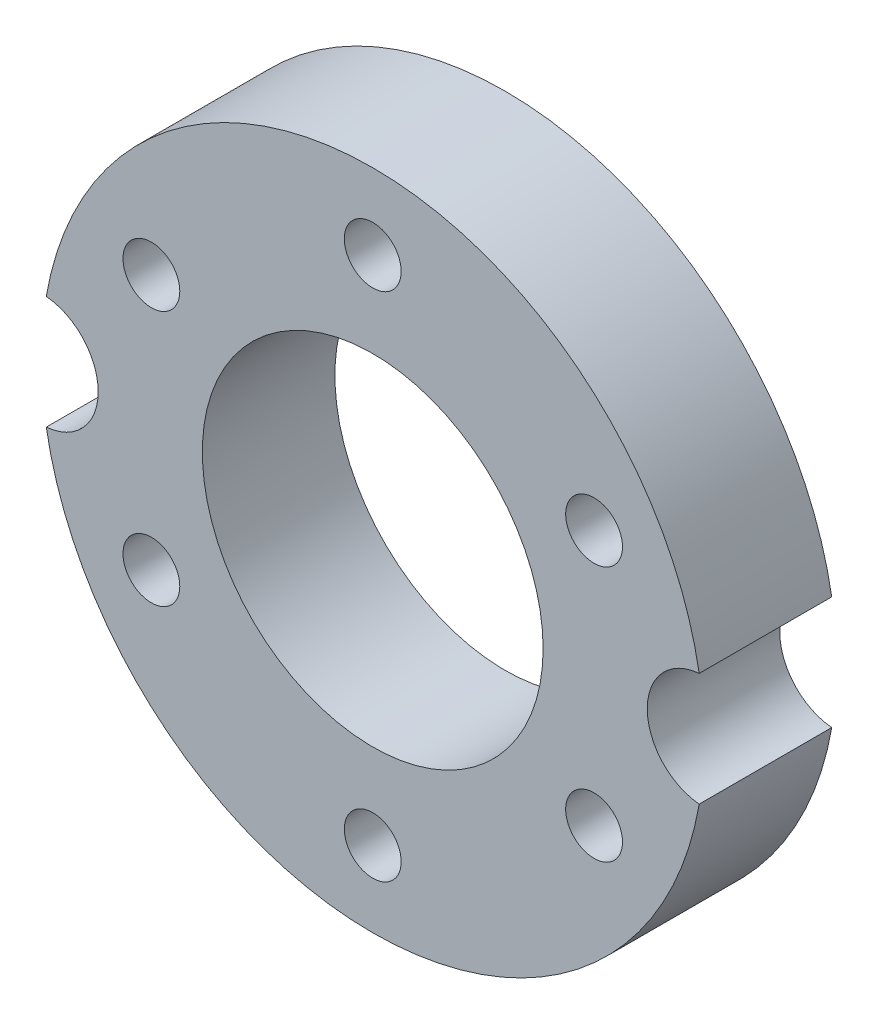
ISO-10303-21;
HEADER;
FILE_DESCRIPTION(('STEP AP214'),'2;1');
FILE_NAME('part.step','',(''),(''),'','','');
FILE_SCHEMA(('AUTOMOTIVE_DESIGN { 1 0 10303 214 1 1 1 1 }'));
ENDSEC;
DATA;
#1=APPLICATION_CONTEXT('core data for automotive mechanical design processes');
#2=APPLICATION_PROTOCOL_DEFINITION('international standard','automotive_design',2000,#1);
#3=PRODUCT_CONTEXT('',#1,'mechanical');
#4=PRODUCT('Part','Part','',(#3));
#5=PRODUCT_RELATED_PRODUCT_CATEGORY('part','',(#4));
#6=PRODUCT_DEFINITION_FORMATION('','',#4);
#7=PRODUCT_DEFINITION_CONTEXT('part definition',#1,'design');
#8=PRODUCT_DEFINITION('design','',#6,#7);
#9=PRODUCT_DEFINITION_SHAPE('','',#8);
#10=(LENGTH_UNIT() NAMED_UNIT(*) SI_UNIT(.MILLI.,.METRE.));
#11=(NAMED_UNIT(*) PLANE_ANGLE_UNIT() SI_UNIT($,.RADIAN.));
#12=(NAMED_UNIT(*) SI_UNIT($,.STERADIAN.) SOLID_ANGLE_UNIT());
#13=UNCERTAINTY_MEASURE_WITH_UNIT(LENGTH_MEASURE(1.E-05),#10,'distance_accuracy_value','');
#14=(GEOMETRIC_REPRESENTATION_CONTEXT(3) GLOBAL_UNCERTAINTY_ASSIGNED_CONTEXT((#13)) GLOBAL_UNIT_ASSIGNED_CONTEXT((#10,
#11,#12)) REPRESENTATION_CONTEXT('',''));
#15=CARTESIAN_POINT('',(0.,0.,0.));
#16=DIRECTION('',(0.,0.,1.));
#17=DIRECTION('',(1.,0.,0.));
#18=AXIS2_PLACEMENT_3D('',#15,#16,#17);
#19=CARTESIAN_POINT('',(17.5,0.,7.));
#20=DIRECTION('',(0.,0.,-1.));
#21=DIRECTION('',(-1.,0.,0.));
#22=AXIS2_PLACEMENT_3D('',#19,#20,#21);
#23=CYLINDRICAL_SURFACE('',#22,3.);
#24=CARTESIAN_POINT('',(17.5,0.,0.));
#25=DIRECTION('',(0.,0.,1.));
#26=DIRECTION('',(1.,0.,0.));
#27=AXIS2_PLACEMENT_3D('',#24,#25,#26);
#28=CIRCLE('',#27,3.);
#29=CARTESIAN_POINT('',(17.2428571428572,2.98895927557073,0.));
#30=VERTEX_POINT('',#29);
#31=CARTESIAN_POINT('',(17.2428571428572,-2.98895927557073,0.));
#32=VERTEX_POINT('',#31);
#33=EDGE_CURVE('E140',#30,#32,#28,.T.);
#34=ORIENTED_EDGE('',*,*,#33,.F.);
#35=DIRECTION('',(0.,0.,-1.));
#36=VECTOR('',#35,1.);
#37=CARTESIAN_POINT('',(17.2428571428572,2.98895927557073,7.));
#38=LINE('',#37,#36);
#39=CARTESIAN_POINT('',(17.2428571428572,2.98895927557073,7.));
#40=VERTEX_POINT('',#39);
#41=EDGE_CURVE('E11',#40,#30,#38,.T.);
#42=ORIENTED_EDGE('',*,*,#41,.F.);
#43=CARTESIAN_POINT('',(17.5,0.,7.));
#44=DIRECTION('',(0.,0.,1.));
#45=DIRECTION('',(1.,0.,0.));
#46=AXIS2_PLACEMENT_3D('',#43,#44,#45);
#47=CIRCLE('',#46,3.);
#48=CARTESIAN_POINT('',(17.2428571428572,-2.98895927557073,7.));
#49=VERTEX_POINT('',#48);
#50=EDGE_CURVE('E97',#40,#49,#47,.T.);
#51=ORIENTED_EDGE('',*,*,#50,.T.);
#52=DIRECTION('',(0.,0.,-1.));
#53=VECTOR('',#52,1.);
#54=CARTESIAN_POINT('',(17.2428571428572,-2.98895927557073,7.));
#55=LINE('',#54,#53);
#56=EDGE_CURVE('E85',#49,#32,#55,.T.);
#57=ORIENTED_EDGE('',*,*,#56,.T.);
#58=EDGE_LOOP('',(#34,#42,#51,#57));
#59=FACE_BOUND('',#58,.T.);
#60=ADVANCED_FACE('F45',(#59),#23,.F.);
#61=CARTESIAN_POINT('',(0.,0.,7.));
#62=DIRECTION('',(0.,0.,-1.));
#63=DIRECTION('',(-1.,0.,0.));
#64=AXIS2_PLACEMENT_3D('',#61,#62,#63);
#65=CYLINDRICAL_SURFACE('',#64,17.5);
#66=CARTESIAN_POINT('',(0.,0.,0.));
#67=DIRECTION('',(0.,0.,1.));
#68=DIRECTION('',(1.,0.,0.));
#69=AXIS2_PLACEMENT_3D('',#66,#67,#68);
#70=CIRCLE('',#69,17.5);
#71=CARTESIAN_POINT('',(-17.2428571428572,2.98895927557073,0.));
#72=VERTEX_POINT('',#71);
#73=EDGE_CURVE('E103',#30,#72,#70,.T.);
#74=ORIENTED_EDGE('',*,*,#73,.T.);
#75=DIRECTION('',(0.,0.,-1.));
#76=VECTOR('',#75,1.);
#77=CARTESIAN_POINT('',(-17.2428571428572,2.98895927557073,7.));
#78=LINE('',#77,#76);
#79=CARTESIAN_POINT('',(-17.2428571428572,2.98895927557073,7.));
#80=VERTEX_POINT('',#79);
#81=EDGE_CURVE('E54',#80,#72,#78,.T.);
#82=ORIENTED_EDGE('',*,*,#81,.F.);
#83=CARTESIAN_POINT('',(0.,0.,7.));
#84=DIRECTION('',(0.,0.,1.));
#85=DIRECTION('',(1.,0.,0.));
#86=AXIS2_PLACEMENT_3D('',#83,#84,#85);
#87=CIRCLE('',#86,17.5);
#88=EDGE_CURVE('E91',#40,#80,#87,.T.);
#89=ORIENTED_EDGE('',*,*,#88,.F.);
#90=ORIENTED_EDGE('',*,*,#41,.T.);
#91=EDGE_LOOP('',(#74,#82,#89,#90));
#92=FACE_BOUND('',#91,.T.);
#93=ADVANCED_FACE('F101',(#92),#65,.T.);
#94=CARTESIAN_POINT('',(-17.5,0.,7.));
#95=DIRECTION('',(0.,0.,-1.));
#96=DIRECTION('',(-1.,0.,0.));
#97=AXIS2_PLACEMENT_3D('',#94,#95,#96);
#98=CYLINDRICAL_SURFACE('',#97,3.);
#99=CARTESIAN_POINT('',(-17.5,0.,0.));
#100=DIRECTION('',(0.,0.,1.));
#101=DIRECTION('',(1.,0.,0.));
#102=AXIS2_PLACEMENT_3D('',#99,#100,#101);
#103=CIRCLE('',#102,3.);
#104=CARTESIAN_POINT('',(-17.2428571428572,-2.98895927557073,0.));
#105=VERTEX_POINT('',#104);
#106=EDGE_CURVE('E78',#72,#105,#103,.F.);
#107=ORIENTED_EDGE('',*,*,#106,.T.);
#108=DIRECTION('',(0.,0.,-1.));
#109=VECTOR('',#108,1.);
#110=CARTESIAN_POINT('',(-17.2428571428572,-2.98895927557073,7.));
#111=LINE('',#110,#109);
#112=CARTESIAN_POINT('',(-17.2428571428572,-2.98895927557073,7.));
#113=VERTEX_POINT('',#112);
#114=EDGE_CURVE('E105',#113,#105,#111,.T.);
#115=ORIENTED_EDGE('',*,*,#114,.F.);
#116=CARTESIAN_POINT('',(-17.5,0.,7.));
#117=DIRECTION('',(0.,0.,1.));
#118=DIRECTION('',(1.,0.,0.));
#119=AXIS2_PLACEMENT_3D('',#116,#117,#118);
#120=CIRCLE('',#119,3.);
#121=EDGE_CURVE('E96',#80,#113,#120,.F.);
#122=ORIENTED_EDGE('',*,*,#121,.F.);
#123=ORIENTED_EDGE('',*,*,#81,.T.);
#124=EDGE_LOOP('',(#107,#115,#122,#123));
#125=FACE_BOUND('',#124,.T.);
#126=ADVANCED_FACE('F106',(#125),#98,.F.);
#127=CARTESIAN_POINT('',(-11.6913429510899,-6.75000000000001,7.));
#128=DIRECTION('',(0.,0.,-1.));
#129=DIRECTION('',(-1.,0.,0.));
#130=AXIS2_PLACEMENT_3D('',#127,#128,#129);
#131=CYLINDRICAL_SURFACE('',#130,1.5);
#132=CARTESIAN_POINT('',(-11.6913429510899,-6.75000000000001,7.));
#133=DIRECTION('',(0.,0.,1.));
#134=DIRECTION('',(1.,0.,0.));
#135=AXIS2_PLACEMENT_3D('',#132,#133,#134);
#136=CIRCLE('',#135,1.5);
#137=CARTESIAN_POINT('',(-10.1913429510899,-6.75000000000001,7.));
#138=VERTEX_POINT('',#137);
#139=EDGE_CURVE('E132',#138,#138,#136,.T.);
#140=ORIENTED_EDGE('',*,*,#139,.T.);
#141=EDGE_LOOP('',(#140));
#142=FACE_BOUND('',#141,.T.);
#143=CARTESIAN_POINT('',(-11.6913429510899,-6.75000000000001,0.));
#144=DIRECTION('',(0.,0.,1.));
#145=DIRECTION('',(1.,0.,0.));
#146=AXIS2_PLACEMENT_3D('',#143,#144,#145);
#147=CIRCLE('',#146,1.5);
#148=CARTESIAN_POINT('',(-10.1913429510899,-6.75000000000001,0.));
#149=VERTEX_POINT('',#148);
#150=EDGE_CURVE('E169',#149,#149,#147,.T.);
#151=ORIENTED_EDGE('',*,*,#150,.F.);
#152=EDGE_LOOP('',(#151));
#153=FACE_BOUND('',#152,.T.);
#154=ADVANCED_FACE('F196',(#142,#153),#131,.F.);
#155=CARTESIAN_POINT('',(0.,-13.5,7.));
#156=DIRECTION('',(0.,0.,-1.));
#157=DIRECTION('',(-1.,0.,0.));
#158=AXIS2_PLACEMENT_3D('',#155,#156,#157);
#159=CYLINDRICAL_SURFACE('',#158,1.5);
#160=CARTESIAN_POINT('',(0.,-13.5,7.));
#161=DIRECTION('',(0.,0.,1.));
#162=DIRECTION('',(1.,0.,0.));
#163=AXIS2_PLACEMENT_3D('',#160,#161,#162);
#164=CIRCLE('',#163,1.5);
#165=CARTESIAN_POINT('',(1.5,-13.5,7.));
#166=VERTEX_POINT('',#165);
#167=EDGE_CURVE('E128',#166,#166,#164,.T.);
#168=ORIENTED_EDGE('',*,*,#167,.T.);
#169=EDGE_LOOP('',(#168));
#170=FACE_BOUND('',#169,.T.);
#171=CARTESIAN_POINT('',(0.,-13.5,0.));
#172=DIRECTION('',(0.,0.,1.));
#173=DIRECTION('',(1.,0.,0.));
#174=AXIS2_PLACEMENT_3D('',#171,#172,#173);
#175=CIRCLE('',#174,1.5);
#176=CARTESIAN_POINT('',(1.5,-13.5,0.));
#177=VERTEX_POINT('',#176);
#178=EDGE_CURVE('E165',#177,#177,#175,.T.);
#179=ORIENTED_EDGE('',*,*,#178,.F.);
#180=EDGE_LOOP('',(#179));
#181=FACE_BOUND('',#180,.T.);
#182=ADVANCED_FACE('F223',(#170,#181),#159,.F.);
#183=CARTESIAN_POINT('',(11.6913429510899,-6.75,7.));
#184=DIRECTION('',(0.,0.,-1.));
#185=DIRECTION('',(-1.,0.,0.));
#186=AXIS2_PLACEMENT_3D('',#183,#184,#185);
#187=CYLINDRICAL_SURFACE('',#186,1.5);
#188=CARTESIAN_POINT('',(11.6913429510899,-6.75,7.));
#189=DIRECTION('',(0.,0.,1.));
#190=DIRECTION('',(1.,0.,0.));
#191=AXIS2_PLACEMENT_3D('',#188,#189,#190);
#192=CIRCLE('',#191,1.5);
#193=CARTESIAN_POINT('',(13.1913429510899,-6.75,7.));
#194=VERTEX_POINT('',#193);
#195=EDGE_CURVE('E124',#194,#194,#192,.T.);
#196=ORIENTED_EDGE('',*,*,#195,.T.);
#197=EDGE_LOOP('',(#196));
#198=FACE_BOUND('',#197,.T.);
#199=CARTESIAN_POINT('',(11.6913429510899,-6.75,0.));
#200=DIRECTION('',(0.,0.,1.));
#201=DIRECTION('',(1.,0.,0.));
#202=AXIS2_PLACEMENT_3D('',#199,#200,#201);
#203=CIRCLE('',#202,1.5);
#204=CARTESIAN_POINT('',(13.1913429510899,-6.75,0.));
#205=VERTEX_POINT('',#204);
#206=EDGE_CURVE('E161',#205,#205,#203,.T.);
#207=ORIENTED_EDGE('',*,*,#206,.F.);
#208=EDGE_LOOP('',(#207));
#209=FACE_BOUND('',#208,.T.);
#210=ADVANCED_FACE('F219',(#198,#209),#187,.F.);
#211=CARTESIAN_POINT('',(11.6913429510899,6.75,7.));
#212=DIRECTION('',(0.,0.,-1.));
#213=DIRECTION('',(-1.,0.,0.));
#214=AXIS2_PLACEMENT_3D('',#211,#212,#213);
#215=CYLINDRICAL_SURFACE('',#214,1.5);
#216=CARTESIAN_POINT('',(11.6913429510899,6.75,7.));
#217=DIRECTION('',(0.,0.,1.));
#218=DIRECTION('',(1.,0.,0.));
#219=AXIS2_PLACEMENT_3D('',#216,#217,#218);
#220=CIRCLE('',#219,1.5);
#221=CARTESIAN_POINT('',(13.1913429510899,6.75,7.));
#222=VERTEX_POINT('',#221);
#223=EDGE_CURVE('E120',#222,#222,#220,.T.);
#224=ORIENTED_EDGE('',*,*,#223,.T.);
#225=EDGE_LOOP('',(#224));
#226=FACE_BOUND('',#225,.T.);
#227=CARTESIAN_POINT('',(11.6913429510899,6.75,0.));
#228=DIRECTION('',(0.,0.,1.));
#229=DIRECTION('',(1.,0.,0.));
#230=AXIS2_PLACEMENT_3D('',#227,#228,#229);
#231=CIRCLE('',#230,1.5);
#232=CARTESIAN_POINT('',(13.1913429510899,6.75,0.));
#233=VERTEX_POINT('',#232);
#234=EDGE_CURVE('E157',#233,#233,#231,.T.);
#235=ORIENTED_EDGE('',*,*,#234,.F.);
#236=EDGE_LOOP('',(#235));
#237=FACE_BOUND('',#236,.T.);
#238=ADVANCED_FACE('F212',(#226,#237),#215,.F.);
#239=CARTESIAN_POINT('',(0.,13.5,7.));
#240=DIRECTION('',(0.,0.,-1.));
#241=DIRECTION('',(-1.,0.,0.));
#242=AXIS2_PLACEMENT_3D('',#239,#240,#241);
#243=CYLINDRICAL_SURFACE('',#242,1.5);
#244=CARTESIAN_POINT('',(0.,13.5,7.));
#245=DIRECTION('',(0.,0.,1.));
#246=DIRECTION('',(1.,0.,0.));
#247=AXIS2_PLACEMENT_3D('',#244,#245,#246);
#248=CIRCLE('',#247,1.5);
#249=CARTESIAN_POINT('',(1.5,13.5,7.));
#250=VERTEX_POINT('',#249);
#251=EDGE_CURVE('E116',#250,#250,#248,.T.);
#252=ORIENTED_EDGE('',*,*,#251,.T.);
#253=EDGE_LOOP('',(#252));
#254=FACE_BOUND('',#253,.T.);
#255=CARTESIAN_POINT('',(0.,13.5,0.));
#256=DIRECTION('',(0.,0.,1.));
#257=DIRECTION('',(1.,0.,0.));
#258=AXIS2_PLACEMENT_3D('',#255,#256,#257);
#259=CIRCLE('',#258,1.5);
#260=CARTESIAN_POINT('',(1.5,13.5,0.));
#261=VERTEX_POINT('',#260);
#262=EDGE_CURVE('E153',#261,#261,#259,.T.);
#263=ORIENTED_EDGE('',*,*,#262,.F.);
#264=EDGE_LOOP('',(#263));
#265=FACE_BOUND('',#264,.T.);
#266=ADVANCED_FACE('F207',(#254,#265),#243,.F.);
#267=CARTESIAN_POINT('',(0.,0.,7.));
#268=DIRECTION('',(0.,0.,-1.));
#269=DIRECTION('',(-1.,0.,0.));
#270=AXIS2_PLACEMENT_3D('',#267,#268,#269);
#271=CYLINDRICAL_SURFACE('',#270,9.);
#272=CARTESIAN_POINT('',(0.,0.,7.));
#273=DIRECTION('',(0.,0.,1.));
#274=DIRECTION('',(1.,0.,0.));
#275=AXIS2_PLACEMENT_3D('',#272,#273,#274);
#276=CIRCLE('',#275,9.);
#277=CARTESIAN_POINT('',(9.,0.,7.));
#278=VERTEX_POINT('',#277);
#279=EDGE_CURVE('E110',#278,#278,#276,.T.);
#280=ORIENTED_EDGE('',*,*,#279,.T.);
#281=EDGE_LOOP('',(#280));
#282=FACE_BOUND('',#281,.T.);
#283=CARTESIAN_POINT('',(0.,0.,0.));
#284=DIRECTION('',(0.,0.,1.));
#285=DIRECTION('',(1.,0.,0.));
#286=AXIS2_PLACEMENT_3D('',#283,#284,#285);
#287=CIRCLE('',#286,9.);
#288=CARTESIAN_POINT('',(9.,0.,0.));
#289=VERTEX_POINT('',#288);
#290=EDGE_CURVE('E149',#289,#289,#287,.T.);
#291=ORIENTED_EDGE('',*,*,#290,.F.);
#292=EDGE_LOOP('',(#291));
#293=FACE_BOUND('',#292,.T.);
#294=ADVANCED_FACE('F200',(#282,#293),#271,.F.);
#295=EDGE_CURVE('E146',#105,#32,#70,.T.);
#296=ORIENTED_EDGE('',*,*,#295,.T.);
#297=ORIENTED_EDGE('',*,*,#56,.F.);
#298=EDGE_CURVE('E62',#113,#49,#87,.T.);
#299=ORIENTED_EDGE('',*,*,#298,.F.);
#300=ORIENTED_EDGE('',*,*,#114,.T.);
#301=EDGE_LOOP('',(#296,#297,#299,#300));
#302=FACE_BOUND('',#301,.T.);
#303=ADVANCED_FACE('F182',(#302),#65,.T.);
#304=CARTESIAN_POINT('',(-11.6913429510899,6.74999999999999,7.));
#305=DIRECTION('',(0.,0.,-1.));
#306=DIRECTION('',(-1.,0.,0.));
#307=AXIS2_PLACEMENT_3D('',#304,#305,#306);
#308=CYLINDRICAL_SURFACE('',#307,1.5);
#309=CARTESIAN_POINT('',(-11.6913429510899,6.74999999999999,7.));
#310=DIRECTION('',(0.,0.,1.));
#311=DIRECTION('',(1.,0.,0.));
#312=AXIS2_PLACEMENT_3D('',#309,#310,#311);
#313=CIRCLE('',#312,1.5);
#314=CARTESIAN_POINT('',(-10.1913429510899,6.74999999999999,7.));
#315=VERTEX_POINT('',#314);
#316=EDGE_CURVE('E136',#315,#315,#313,.T.);
#317=ORIENTED_EDGE('',*,*,#316,.T.);
#318=EDGE_LOOP('',(#317));
#319=FACE_BOUND('',#318,.T.);
#320=CARTESIAN_POINT('',(-11.6913429510899,6.74999999999999,0.));
#321=DIRECTION('',(0.,0.,1.));
#322=DIRECTION('',(1.,0.,0.));
#323=AXIS2_PLACEMENT_3D('',#320,#321,#322);
#324=CIRCLE('',#323,1.5);
#325=CARTESIAN_POINT('',(-10.1913429510899,6.74999999999999,0.));
#326=VERTEX_POINT('',#325);
#327=EDGE_CURVE('E173',#326,#326,#324,.T.);
#328=ORIENTED_EDGE('',*,*,#327,.F.);
#329=EDGE_LOOP('',(#328));
#330=FACE_BOUND('',#329,.T.);
#331=ADVANCED_FACE('F199',(#319,#330),#308,.F.);
#332=CARTESIAN_POINT('',(0.,0.,7.));
#333=DIRECTION('',(0.,0.,1.));
#334=DIRECTION('',(1.,0.,0.));
#335=AXIS2_PLACEMENT_3D('',#332,#333,#334);
#336=PLANE('',#335);
#337=ORIENTED_EDGE('',*,*,#50,.F.);
#338=ORIENTED_EDGE('',*,*,#88,.T.);
#339=ORIENTED_EDGE('',*,*,#121,.T.);
#340=ORIENTED_EDGE('',*,*,#298,.T.);
#341=EDGE_LOOP('',(#337,#338,#339,#340));
#342=FACE_BOUND('',#341,.T.);
#343=ORIENTED_EDGE('',*,*,#279,.F.);
#344=EDGE_LOOP('',(#343));
#345=FACE_BOUND('',#344,.T.);
#346=ORIENTED_EDGE('',*,*,#251,.F.);
#347=EDGE_LOOP('',(#346));
#348=FACE_BOUND('',#347,.T.);
#349=ORIENTED_EDGE('',*,*,#223,.F.);
#350=EDGE_LOOP('',(#349));
#351=FACE_BOUND('',#350,.T.);
#352=ORIENTED_EDGE('',*,*,#195,.F.);
#353=EDGE_LOOP('',(#352));
#354=FACE_BOUND('',#353,.T.);
#355=ORIENTED_EDGE('',*,*,#167,.F.);
#356=EDGE_LOOP('',(#355));
#357=FACE_BOUND('',#356,.T.);
#358=ORIENTED_EDGE('',*,*,#139,.F.);
#359=EDGE_LOOP('',(#358));
#360=FACE_BOUND('',#359,.T.);
#361=ORIENTED_EDGE('',*,*,#316,.F.);
#362=EDGE_LOOP('',(#361));
#363=FACE_BOUND('',#362,.T.);
#364=ADVANCED_FACE('F93',(#342,#345,#348,#351,#354,#357,#360,#363),#336,.T.);
#365=CARTESIAN_POINT('',(0.,0.,0.));
#366=DIRECTION('',(0.,0.,1.));
#367=DIRECTION('',(1.,0.,0.));
#368=AXIS2_PLACEMENT_3D('',#365,#366,#367);
#369=PLANE('',#368);
#370=ORIENTED_EDGE('',*,*,#33,.T.);
#371=ORIENTED_EDGE('',*,*,#295,.F.);
#372=ORIENTED_EDGE('',*,*,#106,.F.);
#373=ORIENTED_EDGE('',*,*,#73,.F.);
#374=EDGE_LOOP('',(#370,#371,#372,#373));
#375=FACE_BOUND('',#374,.T.);
#376=ORIENTED_EDGE('',*,*,#290,.T.);
#377=EDGE_LOOP('',(#376));
#378=FACE_BOUND('',#377,.T.);
#379=ORIENTED_EDGE('',*,*,#262,.T.);
#380=EDGE_LOOP('',(#379));
#381=FACE_BOUND('',#380,.T.);
#382=ORIENTED_EDGE('',*,*,#234,.T.);
#383=EDGE_LOOP('',(#382));
#384=FACE_BOUND('',#383,.T.);
#385=ORIENTED_EDGE('',*,*,#206,.T.);
#386=EDGE_LOOP('',(#385));
#387=FACE_BOUND('',#386,.T.);
#388=ORIENTED_EDGE('',*,*,#178,.T.);
#389=EDGE_LOOP('',(#388));
#390=FACE_BOUND('',#389,.T.);
#391=ORIENTED_EDGE('',*,*,#150,.T.);
#392=EDGE_LOOP('',(#391));
#393=FACE_BOUND('',#392,.T.);
#394=ORIENTED_EDGE('',*,*,#327,.T.);
#395=EDGE_LOOP('',(#394));
#396=FACE_BOUND('',#395,.T.);
#397=ADVANCED_FACE('F184',(#375,#378,#381,#384,#387,#390,#393,#396),#369,.F.);
#398=CLOSED_SHELL('',(#60,#93,#126,#154,#182,#210,#238,#266,#294,#303,#331,#364,#397));
#399=MANIFOLD_SOLID_BREP('B2',#398);
#400=ADVANCED_BREP_SHAPE_REPRESENTATION('',(#18,#399),#14);
#401=SHAPE_DEFINITION_REPRESENTATION(#9,#400);
ENDSEC;
END-ISO-10303-21;
